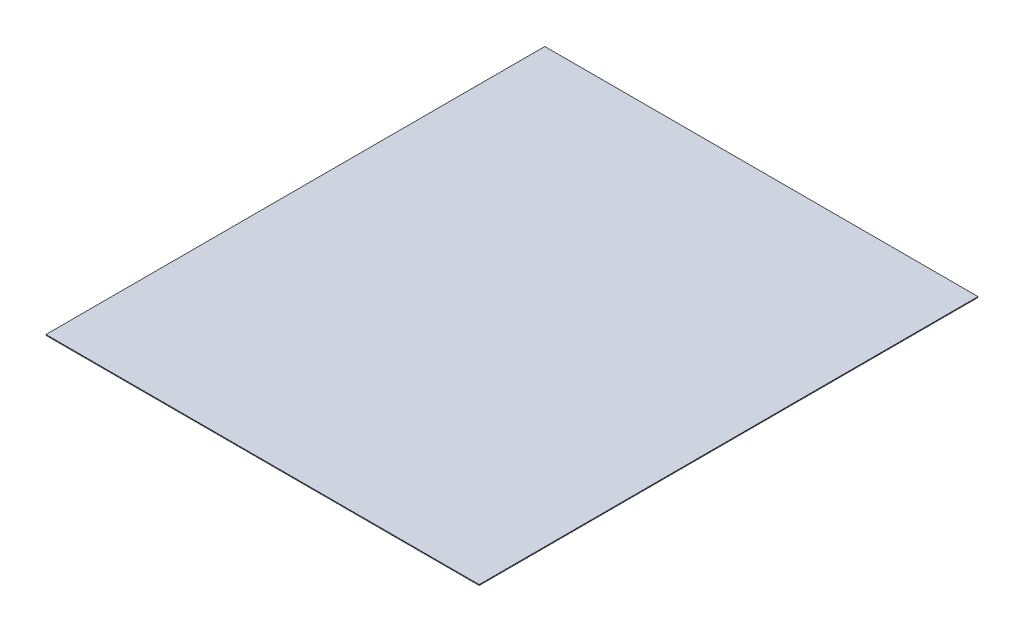
ISO-10303-21;
HEADER;
FILE_DESCRIPTION(('STEP AP214'),'2;1');
FILE_NAME('part.step','',(''),(''),'','','');
FILE_SCHEMA(('AUTOMOTIVE_DESIGN { 1 0 10303 214 1 1 1 1 }'));
ENDSEC;
DATA;
#1=APPLICATION_CONTEXT('core data for automotive mechanical design processes');
#2=APPLICATION_PROTOCOL_DEFINITION('international standard','automotive_design',2000,#1);
#3=PRODUCT_CONTEXT('',#1,'mechanical');
#4=PRODUCT('Part','Part','',(#3));
#5=PRODUCT_RELATED_PRODUCT_CATEGORY('part','',(#4));
#6=PRODUCT_DEFINITION_FORMATION('','',#4);
#7=PRODUCT_DEFINITION_CONTEXT('part definition',#1,'design');
#8=PRODUCT_DEFINITION('design','',#6,#7);
#9=PRODUCT_DEFINITION_SHAPE('','',#8);
#10=(LENGTH_UNIT() NAMED_UNIT(*) SI_UNIT(.MILLI.,.METRE.));
#11=(NAMED_UNIT(*) PLANE_ANGLE_UNIT() SI_UNIT($,.RADIAN.));
#12=(NAMED_UNIT(*) SI_UNIT($,.STERADIAN.) SOLID_ANGLE_UNIT());
#13=UNCERTAINTY_MEASURE_WITH_UNIT(LENGTH_MEASURE(1.E-05),#10,'distance_accuracy_value','');
#14=(GEOMETRIC_REPRESENTATION_CONTEXT(3) GLOBAL_UNCERTAINTY_ASSIGNED_CONTEXT((#13)) GLOBAL_UNIT_ASSIGNED_CONTEXT((#10,
#11,#12)) REPRESENTATION_CONTEXT('',''));
#15=CARTESIAN_POINT('',(0.,0.,0.));
#16=DIRECTION('',(0.,0.,1.));
#17=DIRECTION('',(1.,0.,0.));
#18=AXIS2_PLACEMENT_3D('',#15,#16,#17);
#19=CARTESIAN_POINT('',(-875.782817798294,3.175,917.245300666462));
#20=DIRECTION('',(1.,0.,0.));
#21=DIRECTION('',(0.,0.,-1.));
#22=AXIS2_PLACEMENT_3D('',#19,#20,#21);
#23=PLANE('',#22);
#24=DIRECTION('',(0.,0.,1.));
#25=VECTOR('',#24,1.);
#26=CARTESIAN_POINT('',(-875.782817798294,0.,917.245300666462));
#27=LINE('',#26,#25);
#28=CARTESIAN_POINT('',(-875.782817798294,0.,-1013.15469933354));
#29=VERTEX_POINT('',#28);
#30=CARTESIAN_POINT('',(-875.782817798294,0.,917.245300666462));
#31=VERTEX_POINT('',#30);
#32=EDGE_CURVE('E99',#29,#31,#27,.T.);
#33=ORIENTED_EDGE('',*,*,#32,.T.);
#34=DIRECTION('',(0.,-1.,0.));
#35=VECTOR('',#34,1.);
#36=CARTESIAN_POINT('',(-875.782817798294,3.175,917.245300666462));
#37=LINE('',#36,#35);
#38=CARTESIAN_POINT('',(-875.782817798294,3.175,917.245300666462));
#39=VERTEX_POINT('',#38);
#40=EDGE_CURVE('E11',#39,#31,#37,.T.);
#41=ORIENTED_EDGE('',*,*,#40,.F.);
#42=DIRECTION('',(0.,0.,1.));
#43=VECTOR('',#42,1.);
#44=CARTESIAN_POINT('',(-875.782817798294,3.175,917.245300666462));
#45=LINE('',#44,#43);
#46=CARTESIAN_POINT('',(-875.782817798294,3.175,-1013.15469933354));
#47=VERTEX_POINT('',#46);
#48=EDGE_CURVE('E87',#47,#39,#45,.T.);
#49=ORIENTED_EDGE('',*,*,#48,.F.);
#50=DIRECTION('',(0.,-1.,0.));
#51=VECTOR('',#50,1.);
#52=CARTESIAN_POINT('',(-875.782817798294,3.175,-1013.15469933354));
#53=LINE('',#52,#51);
#54=EDGE_CURVE('E95',#47,#29,#53,.T.);
#55=ORIENTED_EDGE('',*,*,#54,.T.);
#56=EDGE_LOOP('',(#33,#41,#49,#55));
#57=FACE_BOUND('',#56,.T.);
#58=ADVANCED_FACE('F36',(#57),#23,.F.);
#59=CARTESIAN_POINT('',(-875.782817798294,3.175,917.245300666462));
#60=DIRECTION('',(0.,0.,-1.));
#61=DIRECTION('',(-1.,0.,0.));
#62=AXIS2_PLACEMENT_3D('',#59,#60,#61);
#63=PLANE('',#62);
#64=DIRECTION('',(1.,0.,0.));
#65=VECTOR('',#64,1.);
#66=CARTESIAN_POINT('',(-875.782817798294,0.,917.245300666462));
#67=LINE('',#66,#65);
#68=CARTESIAN_POINT('',(800.617182201706,0.,917.245300666462));
#69=VERTEX_POINT('',#68);
#70=EDGE_CURVE('E91',#31,#69,#67,.T.);
#71=ORIENTED_EDGE('',*,*,#70,.T.);
#72=DIRECTION('',(0.,-1.,0.));
#73=VECTOR('',#72,1.);
#74=CARTESIAN_POINT('',(800.617182201706,3.175,917.245300666462));
#75=LINE('',#74,#73);
#76=CARTESIAN_POINT('',(800.617182201706,3.175,917.245300666462));
#77=VERTEX_POINT('',#76);
#78=EDGE_CURVE('E44',#77,#69,#75,.T.);
#79=ORIENTED_EDGE('',*,*,#78,.F.);
#80=DIRECTION('',(1.,0.,0.));
#81=VECTOR('',#80,1.);
#82=CARTESIAN_POINT('',(-875.782817798294,3.175,917.245300666462));
#83=LINE('',#82,#81);
#84=EDGE_CURVE('E82',#39,#77,#83,.T.);
#85=ORIENTED_EDGE('',*,*,#84,.F.);
#86=ORIENTED_EDGE('',*,*,#40,.T.);
#87=EDGE_LOOP('',(#71,#79,#85,#86));
#88=FACE_BOUND('',#87,.T.);
#89=ADVANCED_FACE('F90',(#88),#63,.F.);
#90=CARTESIAN_POINT('',(800.617182201706,3.175,917.245300666462));
#91=DIRECTION('',(-1.,0.,0.));
#92=DIRECTION('',(0.,0.,1.));
#93=AXIS2_PLACEMENT_3D('',#90,#91,#92);
#94=PLANE('',#93);
#95=DIRECTION('',(0.,0.,-1.));
#96=VECTOR('',#95,1.);
#97=CARTESIAN_POINT('',(800.617182201706,0.,917.245300666462));
#98=LINE('',#97,#96);
#99=CARTESIAN_POINT('',(800.617182201706,0.,-1013.15469933354));
#100=VERTEX_POINT('',#99);
#101=EDGE_CURVE('E69',#69,#100,#98,.T.);
#102=ORIENTED_EDGE('',*,*,#101,.T.);
#103=DIRECTION('',(0.,-1.,0.));
#104=VECTOR('',#103,1.);
#105=CARTESIAN_POINT('',(800.617182201706,3.175,-1013.15469933354));
#106=LINE('',#105,#104);
#107=CARTESIAN_POINT('',(800.617182201706,3.175,-1013.15469933354));
#108=VERTEX_POINT('',#107);
#109=EDGE_CURVE('E92',#108,#100,#106,.T.);
#110=ORIENTED_EDGE('',*,*,#109,.F.);
#111=DIRECTION('',(0.,0.,-1.));
#112=VECTOR('',#111,1.);
#113=CARTESIAN_POINT('',(800.617182201706,3.175,917.245300666462));
#114=LINE('',#113,#112);
#115=EDGE_CURVE('E85',#77,#108,#114,.T.);
#116=ORIENTED_EDGE('',*,*,#115,.F.);
#117=ORIENTED_EDGE('',*,*,#78,.T.);
#118=EDGE_LOOP('',(#102,#110,#116,#117));
#119=FACE_BOUND('',#118,.T.);
#120=ADVANCED_FACE('F93',(#119),#94,.F.);
#121=CARTESIAN_POINT('',(-875.782817798294,3.175,-1013.15469933354));
#122=DIRECTION('',(0.,0.,1.));
#123=DIRECTION('',(1.,0.,0.));
#124=AXIS2_PLACEMENT_3D('',#121,#122,#123);
#125=PLANE('',#124);
#126=DIRECTION('',(-1.,0.,0.));
#127=VECTOR('',#126,1.);
#128=CARTESIAN_POINT('',(-875.782817798294,0.,-1013.15469933354));
#129=LINE('',#128,#127);
#130=EDGE_CURVE('E75',#100,#29,#129,.T.);
#131=ORIENTED_EDGE('',*,*,#130,.T.);
#132=ORIENTED_EDGE('',*,*,#54,.F.);
#133=DIRECTION('',(-1.,0.,0.));
#134=VECTOR('',#133,1.);
#135=CARTESIAN_POINT('',(-875.782817798294,3.175,-1013.15469933354));
#136=LINE('',#135,#134);
#137=EDGE_CURVE('E52',#108,#47,#136,.T.);
#138=ORIENTED_EDGE('',*,*,#137,.F.);
#139=ORIENTED_EDGE('',*,*,#109,.T.);
#140=EDGE_LOOP('',(#131,#132,#138,#139));
#141=FACE_BOUND('',#140,.T.);
#142=ADVANCED_FACE('F106',(#141),#125,.F.);
#143=CARTESIAN_POINT('',(0.,3.175,0.));
#144=DIRECTION('',(0.,-1.,0.));
#145=DIRECTION('',(0.,0.,-1.));
#146=AXIS2_PLACEMENT_3D('',#143,#144,#145);
#147=PLANE('',#146);
#148=ORIENTED_EDGE('',*,*,#48,.T.);
#149=ORIENTED_EDGE('',*,*,#84,.T.);
#150=ORIENTED_EDGE('',*,*,#115,.T.);
#151=ORIENTED_EDGE('',*,*,#137,.T.);
#152=EDGE_LOOP('',(#148,#149,#150,#151));
#153=FACE_BOUND('',#152,.T.);
#154=ADVANCED_FACE('F83',(#153),#147,.F.);
#155=CARTESIAN_POINT('',(0.,0.,0.));
#156=DIRECTION('',(0.,-1.,0.));
#157=DIRECTION('',(0.,0.,-1.));
#158=AXIS2_PLACEMENT_3D('',#155,#156,#157);
#159=PLANE('',#158);
#160=ORIENTED_EDGE('',*,*,#32,.F.);
#161=ORIENTED_EDGE('',*,*,#130,.F.);
#162=ORIENTED_EDGE('',*,*,#101,.F.);
#163=ORIENTED_EDGE('',*,*,#70,.F.);
#164=EDGE_LOOP('',(#160,#161,#162,#163));
#165=FACE_BOUND('',#164,.T.);
#166=ADVANCED_FACE('F109',(#165),#159,.T.);
#167=CLOSED_SHELL('',(#58,#89,#120,#142,#154,#166));
#168=MANIFOLD_SOLID_BREP('B2',#167);
#169=ADVANCED_BREP_SHAPE_REPRESENTATION('',(#18,#168),#14);
#170=SHAPE_DEFINITION_REPRESENTATION(#9,#169);
ENDSEC;
END-ISO-10303-21;
